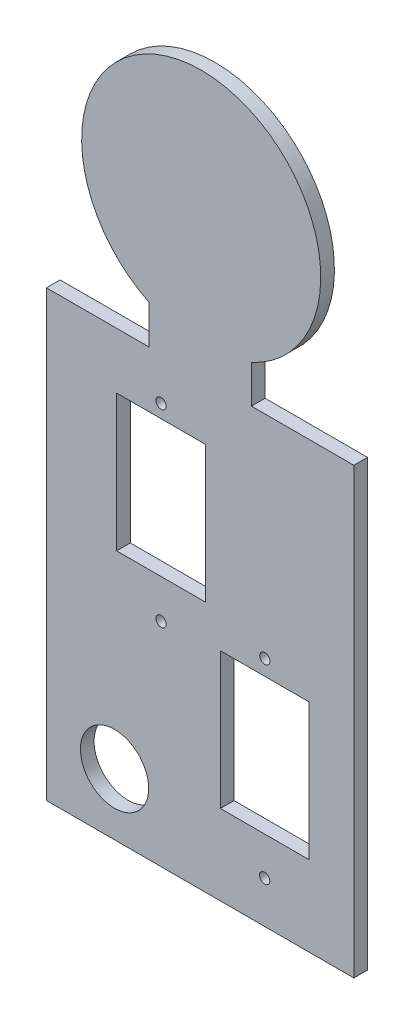
ISO-10303-21;
HEADER;
FILE_DESCRIPTION(('STEP AP214'),'2;1');
FILE_NAME('part.step','',(''),(''),'','','');
FILE_SCHEMA(('AUTOMOTIVE_DESIGN { 1 0 10303 214 1 1 1 1 }'));
ENDSEC;
DATA;
#1=APPLICATION_CONTEXT('core data for automotive mechanical design processes');
#2=APPLICATION_PROTOCOL_DEFINITION('international standard','automotive_design',2000,#1);
#3=PRODUCT_CONTEXT('',#1,'mechanical');
#4=PRODUCT('Part','Part','',(#3));
#5=PRODUCT_RELATED_PRODUCT_CATEGORY('part','',(#4));
#6=PRODUCT_DEFINITION_FORMATION('','',#4);
#7=PRODUCT_DEFINITION_CONTEXT('part definition',#1,'design');
#8=PRODUCT_DEFINITION('design','',#6,#7);
#9=PRODUCT_DEFINITION_SHAPE('','',#8);
#10=(LENGTH_UNIT() NAMED_UNIT(*) SI_UNIT(.MILLI.,.METRE.));
#11=(NAMED_UNIT(*) PLANE_ANGLE_UNIT() SI_UNIT($,.RADIAN.));
#12=(NAMED_UNIT(*) SI_UNIT($,.STERADIAN.) SOLID_ANGLE_UNIT());
#13=UNCERTAINTY_MEASURE_WITH_UNIT(LENGTH_MEASURE(1.E-05),#10,'distance_accuracy_value','');
#14=(GEOMETRIC_REPRESENTATION_CONTEXT(3) GLOBAL_UNCERTAINTY_ASSIGNED_CONTEXT((#13)) GLOBAL_UNIT_ASSIGNED_CONTEXT((#10,
#11,#12)) REPRESENTATION_CONTEXT('',''));
#15=CARTESIAN_POINT('',(0.,0.,0.));
#16=DIRECTION('',(0.,0.,1.));
#17=DIRECTION('',(1.,0.,0.));
#18=AXIS2_PLACEMENT_3D('',#15,#16,#17);
#19=CARTESIAN_POINT('',(0.,0.,2.));
#20=DIRECTION('',(0.,0.,-1.));
#21=DIRECTION('',(-1.,0.,0.));
#22=AXIS2_PLACEMENT_3D('',#19,#20,#21);
#23=CYLINDRICAL_SURFACE('',#22,17.5);
#24=CARTESIAN_POINT('',(0.,0.,0.));
#25=DIRECTION('',(0.,0.,1.));
#26=DIRECTION('',(1.,0.,0.));
#27=AXIS2_PLACEMENT_3D('',#24,#25,#26);
#28=CIRCLE('',#27,17.5);
#29=CARTESIAN_POINT('',(7.34840143217051,-15.8824115420699,0.));
#30=VERTEX_POINT('',#29);
#31=CARTESIAN_POINT('',(-7.65159856782949,-15.7385844140059,0.));
#32=VERTEX_POINT('',#31);
#33=EDGE_CURVE('E192',#30,#32,#28,.T.);
#34=ORIENTED_EDGE('',*,*,#33,.T.);
#35=DIRECTION('',(0.,0.,-1.));
#36=VECTOR('',#35,1.);
#37=CARTESIAN_POINT('',(-7.65159856782949,-15.7385844140059,2.));
#38=LINE('',#37,#36);
#39=CARTESIAN_POINT('',(-7.65159856782949,-15.7385844140059,2.));
#40=VERTEX_POINT('',#39);
#41=EDGE_CURVE('E272',#40,#32,#38,.T.);
#42=ORIENTED_EDGE('',*,*,#41,.F.);
#43=CARTESIAN_POINT('',(0.,0.,2.));
#44=DIRECTION('',(0.,0.,1.));
#45=DIRECTION('',(1.,0.,0.));
#46=AXIS2_PLACEMENT_3D('',#43,#44,#45);
#47=CIRCLE('',#46,17.5);
#48=CARTESIAN_POINT('',(7.34840143217051,-15.8824115420699,2.));
#49=VERTEX_POINT('',#48);
#50=EDGE_CURVE('E214',#49,#40,#47,.T.);
#51=ORIENTED_EDGE('',*,*,#50,.F.);
#52=DIRECTION('',(0.,0.,-1.));
#53=VECTOR('',#52,1.);
#54=CARTESIAN_POINT('',(7.34840143217051,-15.8824115420699,2.));
#55=LINE('',#54,#53);
#56=EDGE_CURVE('E236',#49,#30,#55,.T.);
#57=ORIENTED_EDGE('',*,*,#56,.T.);
#58=EDGE_LOOP('',(#34,#42,#51,#57));
#59=FACE_BOUND('',#58,.T.);
#60=ADVANCED_FACE('F47',(#59),#23,.T.);
#61=CARTESIAN_POINT('',(-7.65159856782949,-15.7385844140059,2.));
#62=DIRECTION('',(1.,0.,0.));
#63=DIRECTION('',(0.,0.,-1.));
#64=AXIS2_PLACEMENT_3D('',#61,#62,#63);
#65=PLANE('',#64);
#66=DIRECTION('',(0.,-1.,0.));
#67=VECTOR('',#66,1.);
#68=CARTESIAN_POINT('',(-7.65159856782949,-15.7385844140059,0.));
#69=LINE('',#68,#67);
#70=CARTESIAN_POINT('',(-7.65159856782949,-21.4190799899302,0.));
#71=VERTEX_POINT('',#70);
#72=EDGE_CURVE('E239',#32,#71,#69,.T.);
#73=ORIENTED_EDGE('',*,*,#72,.T.);
#74=DIRECTION('',(0.,0.,-1.));
#75=VECTOR('',#74,1.);
#76=CARTESIAN_POINT('',(-7.65159856782949,-21.4190799899302,2.));
#77=LINE('',#76,#75);
#78=CARTESIAN_POINT('',(-7.65159856782949,-21.4190799899302,2.));
#79=VERTEX_POINT('',#78);
#80=EDGE_CURVE('E270',#79,#71,#77,.T.);
#81=ORIENTED_EDGE('',*,*,#80,.F.);
#82=DIRECTION('',(0.,-1.,0.));
#83=VECTOR('',#82,1.);
#84=CARTESIAN_POINT('',(-7.65159856782949,-15.7385844140059,2.));
#85=LINE('',#84,#83);
#86=EDGE_CURVE('E217',#40,#79,#85,.T.);
#87=ORIENTED_EDGE('',*,*,#86,.F.);
#88=ORIENTED_EDGE('',*,*,#41,.T.);
#89=EDGE_LOOP('',(#73,#81,#87,#88));
#90=FACE_BOUND('',#89,.T.);
#91=ADVANCED_FACE('F325',(#90),#65,.F.);
#92=CARTESIAN_POINT('',(-22.6515985678295,-21.4190799899302,2.));
#93=DIRECTION('',(0.,1.,0.));
#94=DIRECTION('',(0.,0.,1.));
#95=AXIS2_PLACEMENT_3D('',#92,#93,#94);
#96=PLANE('',#95);
#97=DIRECTION('',(1.,0.,0.));
#98=VECTOR('',#97,1.);
#99=CARTESIAN_POINT('',(-22.6515985678295,-21.4190799899302,0.));
#100=LINE('',#99,#98);
#101=CARTESIAN_POINT('',(-22.6515985678295,-21.4190799899302,0.));
#102=VERTEX_POINT('',#101);
#103=EDGE_CURVE('E242',#102,#71,#100,.T.);
#104=ORIENTED_EDGE('',*,*,#103,.F.);
#105=DIRECTION('',(0.,0.,-1.));
#106=VECTOR('',#105,1.);
#107=CARTESIAN_POINT('',(-22.6515985678295,-21.4190799899302,2.));
#108=LINE('',#107,#106);
#109=CARTESIAN_POINT('',(-22.6515985678295,-21.4190799899302,2.));
#110=VERTEX_POINT('',#109);
#111=EDGE_CURVE('E268',#110,#102,#108,.T.);
#112=ORIENTED_EDGE('',*,*,#111,.F.);
#113=DIRECTION('',(1.,0.,0.));
#114=VECTOR('',#113,1.);
#115=CARTESIAN_POINT('',(-22.6515985678295,-21.4190799899302,2.));
#116=LINE('',#115,#114);
#117=EDGE_CURVE('E220',#110,#79,#116,.T.);
#118=ORIENTED_EDGE('',*,*,#117,.T.);
#119=ORIENTED_EDGE('',*,*,#80,.T.);
#120=EDGE_LOOP('',(#104,#112,#118,#119));
#121=FACE_BOUND('',#120,.T.);
#122=ADVANCED_FACE('F330',(#121),#96,.T.);
#123=CARTESIAN_POINT('',(-22.6515985678295,-21.4190799899302,2.));
#124=DIRECTION('',(1.,0.,0.));
#125=DIRECTION('',(0.,1.,0.));
#126=AXIS2_PLACEMENT_3D('',#123,#124,#125);
#127=PLANE('',#126);
#128=DIRECTION('',(0.,-1.,0.));
#129=VECTOR('',#128,1.);
#130=CARTESIAN_POINT('',(-22.6515985678295,-21.4190799899302,0.));
#131=LINE('',#130,#129);
#132=CARTESIAN_POINT('',(-22.6515985678295,-86.4190799899302,0.));
#133=VERTEX_POINT('',#132);
#134=EDGE_CURVE('E245',#102,#133,#131,.T.);
#135=ORIENTED_EDGE('',*,*,#134,.T.);
#136=DIRECTION('',(0.,0.,-1.));
#137=VECTOR('',#136,1.);
#138=CARTESIAN_POINT('',(-22.6515985678295,-86.4190799899302,2.));
#139=LINE('',#138,#137);
#140=CARTESIAN_POINT('',(-22.6515985678295,-86.4190799899302,2.));
#141=VERTEX_POINT('',#140);
#142=EDGE_CURVE('E265',#141,#133,#139,.T.);
#143=ORIENTED_EDGE('',*,*,#142,.F.);
#144=DIRECTION('',(0.,-1.,0.));
#145=VECTOR('',#144,1.);
#146=CARTESIAN_POINT('',(-22.6515985678295,-21.4190799899302,2.));
#147=LINE('',#146,#145);
#148=EDGE_CURVE('E223',#110,#141,#147,.T.);
#149=ORIENTED_EDGE('',*,*,#148,.F.);
#150=ORIENTED_EDGE('',*,*,#111,.T.);
#151=EDGE_LOOP('',(#135,#143,#149,#150));
#152=FACE_BOUND('',#151,.T.);
#153=ADVANCED_FACE('F357',(#152),#127,.F.);
#154=CARTESIAN_POINT('',(-22.6515985678295,-86.4190799899302,2.));
#155=DIRECTION('',(0.,1.,0.));
#156=DIRECTION('',(0.,0.,1.));
#157=AXIS2_PLACEMENT_3D('',#154,#155,#156);
#158=PLANE('',#157);
#159=DIRECTION('',(1.,0.,0.));
#160=VECTOR('',#159,1.);
#161=CARTESIAN_POINT('',(-22.6515985678295,-86.4190799899302,0.));
#162=LINE('',#161,#160);
#163=CARTESIAN_POINT('',(22.3484014321705,-86.4190799899302,0.));
#164=VERTEX_POINT('',#163);
#165=EDGE_CURVE('E247',#133,#164,#162,.T.);
#166=ORIENTED_EDGE('',*,*,#165,.T.);
#167=DIRECTION('',(0.,0.,-1.));
#168=VECTOR('',#167,1.);
#169=CARTESIAN_POINT('',(22.3484014321705,-86.4190799899302,2.));
#170=LINE('',#169,#168);
#171=CARTESIAN_POINT('',(22.3484014321705,-86.4190799899302,2.));
#172=VERTEX_POINT('',#171);
#173=EDGE_CURVE('E263',#172,#164,#170,.T.);
#174=ORIENTED_EDGE('',*,*,#173,.F.);
#175=DIRECTION('',(1.,0.,0.));
#176=VECTOR('',#175,1.);
#177=CARTESIAN_POINT('',(-22.6515985678295,-86.4190799899302,2.));
#178=LINE('',#177,#176);
#179=EDGE_CURVE('E225',#141,#172,#178,.T.);
#180=ORIENTED_EDGE('',*,*,#179,.F.);
#181=ORIENTED_EDGE('',*,*,#142,.T.);
#182=EDGE_LOOP('',(#166,#174,#180,#181));
#183=FACE_BOUND('',#182,.T.);
#184=ADVANCED_FACE('F353',(#183),#158,.F.);
#185=CARTESIAN_POINT('',(22.3484014321705,-21.4190799899302,2.));
#186=DIRECTION('',(1.,0.,0.));
#187=DIRECTION('',(0.,1.,0.));
#188=AXIS2_PLACEMENT_3D('',#185,#186,#187);
#189=PLANE('',#188);
#190=DIRECTION('',(0.,-1.,0.));
#191=VECTOR('',#190,1.);
#192=CARTESIAN_POINT('',(22.3484014321705,-21.4190799899302,0.));
#193=LINE('',#192,#191);
#194=CARTESIAN_POINT('',(22.3484014321705,-21.4190799899302,0.));
#195=VERTEX_POINT('',#194);
#196=EDGE_CURVE('E250',#195,#164,#193,.T.);
#197=ORIENTED_EDGE('',*,*,#196,.F.);
#198=DIRECTION('',(0.,0.,-1.));
#199=VECTOR('',#198,1.);
#200=CARTESIAN_POINT('',(22.3484014321705,-21.4190799899302,2.));
#201=LINE('',#200,#199);
#202=CARTESIAN_POINT('',(22.3484014321705,-21.4190799899302,2.));
#203=VERTEX_POINT('',#202);
#204=EDGE_CURVE('E261',#203,#195,#201,.T.);
#205=ORIENTED_EDGE('',*,*,#204,.F.);
#206=DIRECTION('',(0.,-1.,0.));
#207=VECTOR('',#206,1.);
#208=CARTESIAN_POINT('',(22.3484014321705,-21.4190799899302,2.));
#209=LINE('',#208,#207);
#210=EDGE_CURVE('E227',#203,#172,#209,.T.);
#211=ORIENTED_EDGE('',*,*,#210,.T.);
#212=ORIENTED_EDGE('',*,*,#173,.T.);
#213=EDGE_LOOP('',(#197,#205,#211,#212));
#214=FACE_BOUND('',#213,.T.);
#215=ADVANCED_FACE('F348',(#214),#189,.T.);
#216=CARTESIAN_POINT('',(7.34840143217051,-21.4190799899302,2.));
#217=DIRECTION('',(0.,1.,0.));
#218=DIRECTION('',(0.,0.,1.));
#219=AXIS2_PLACEMENT_3D('',#216,#217,#218);
#220=PLANE('',#219);
#221=DIRECTION('',(1.,0.,0.));
#222=VECTOR('',#221,1.);
#223=CARTESIAN_POINT('',(7.34840143217051,-21.4190799899302,0.));
#224=LINE('',#223,#222);
#225=CARTESIAN_POINT('',(7.34840143217051,-21.4190799899302,0.));
#226=VERTEX_POINT('',#225);
#227=EDGE_CURVE('E253',#226,#195,#224,.T.);
#228=ORIENTED_EDGE('',*,*,#227,.F.);
#229=DIRECTION('',(0.,0.,-1.));
#230=VECTOR('',#229,1.);
#231=CARTESIAN_POINT('',(7.34840143217051,-21.4190799899302,2.));
#232=LINE('',#231,#230);
#233=CARTESIAN_POINT('',(7.34840143217051,-21.4190799899302,2.));
#234=VERTEX_POINT('',#233);
#235=EDGE_CURVE('E259',#234,#226,#232,.T.);
#236=ORIENTED_EDGE('',*,*,#235,.F.);
#237=DIRECTION('',(1.,0.,0.));
#238=VECTOR('',#237,1.);
#239=CARTESIAN_POINT('',(7.34840143217051,-21.4190799899302,2.));
#240=LINE('',#239,#238);
#241=EDGE_CURVE('E230',#234,#203,#240,.T.);
#242=ORIENTED_EDGE('',*,*,#241,.T.);
#243=ORIENTED_EDGE('',*,*,#204,.T.);
#244=EDGE_LOOP('',(#228,#236,#242,#243));
#245=FACE_BOUND('',#244,.T.);
#246=ADVANCED_FACE('F343',(#245),#220,.T.);
#247=CARTESIAN_POINT('',(7.34840143217051,-15.8824115420699,2.));
#248=DIRECTION('',(1.,0.,0.));
#249=DIRECTION('',(0.,0.,-1.));
#250=AXIS2_PLACEMENT_3D('',#247,#248,#249);
#251=PLANE('',#250);
#252=DIRECTION('',(0.,-1.,0.));
#253=VECTOR('',#252,1.);
#254=CARTESIAN_POINT('',(7.34840143217051,-15.8824115420699,0.));
#255=LINE('',#254,#253);
#256=EDGE_CURVE('E218',#30,#226,#255,.T.);
#257=ORIENTED_EDGE('',*,*,#256,.F.);
#258=ORIENTED_EDGE('',*,*,#56,.F.);
#259=DIRECTION('',(0.,-1.,0.));
#260=VECTOR('',#259,1.);
#261=CARTESIAN_POINT('',(7.34840143217051,-15.8824115420699,2.));
#262=LINE('',#261,#260);
#263=EDGE_CURVE('E233',#49,#234,#262,.T.);
#264=ORIENTED_EDGE('',*,*,#263,.T.);
#265=ORIENTED_EDGE('',*,*,#235,.T.);
#266=EDGE_LOOP('',(#257,#258,#264,#265));
#267=FACE_BOUND('',#266,.T.);
#268=ADVANCED_FACE('F338',(#267),#251,.T.);
#269=CARTESIAN_POINT('',(0.,0.,2.));
#270=DIRECTION('',(0.,0.,1.));
#271=DIRECTION('',(1.,0.,0.));
#272=AXIS2_PLACEMENT_3D('',#269,#270,#271);
#273=PLANE('',#272);
#274=CARTESIAN_POINT('',(-12.6867038328696,-77.4152055983344,2.));
#275=DIRECTION('',(0.,0.,1.));
#276=DIRECTION('',(1.,0.,0.));
#277=AXIS2_PLACEMENT_3D('',#274,#275,#276);
#278=CIRCLE('',#277,5.00000000000001);
#279=CARTESIAN_POINT('',(-7.68670383286962,-77.4152055983344,2.));
#280=VERTEX_POINT('',#279);
#281=EDGE_CURVE('E608',#280,#280,#278,.T.);
#282=ORIENTED_EDGE('',*,*,#281,.F.);
#283=EDGE_LOOP('',(#282));
#284=FACE_BOUND('',#283,.T.);
#285=CARTESIAN_POINT('',(-5.87460933445811,-27.6794868217812,2.));
#286=DIRECTION('',(0.,0.,1.));
#287=DIRECTION('',(1.,0.,0.));
#288=AXIS2_PLACEMENT_3D('',#285,#286,#287);
#289=CIRCLE('',#288,0.749999999999999);
#290=CARTESIAN_POINT('',(-5.12460933445811,-27.6794868217812,2.));
#291=VERTEX_POINT('',#290);
#292=EDGE_CURVE('E296',#291,#291,#289,.T.);
#293=ORIENTED_EDGE('',*,*,#292,.F.);
#294=EDGE_LOOP('',(#293));
#295=FACE_BOUND('',#294,.T.);
#296=CARTESIAN_POINT('',(-5.87460933445811,-55.3133694888777,2.));
#297=DIRECTION('',(0.,0.,1.));
#298=DIRECTION('',(1.,0.,0.));
#299=AXIS2_PLACEMENT_3D('',#296,#297,#298);
#300=CIRCLE('',#299,0.749999999999999);
#301=CARTESIAN_POINT('',(-5.12460933445811,-55.3133694888777,2.));
#302=VERTEX_POINT('',#301);
#303=EDGE_CURVE('E604',#302,#302,#300,.T.);
#304=ORIENTED_EDGE('',*,*,#303,.F.);
#305=EDGE_LOOP('',(#304));
#306=FACE_BOUND('',#305,.T.);
#307=CARTESIAN_POINT('',(9.31821406157874,-52.4318876720628,2.));
#308=DIRECTION('',(0.,0.,1.));
#309=DIRECTION('',(1.,0.,0.));
#310=AXIS2_PLACEMENT_3D('',#307,#308,#309);
#311=CIRCLE('',#310,0.75);
#312=CARTESIAN_POINT('',(10.0682140615787,-52.4318876720628,2.));
#313=VERTEX_POINT('',#312);
#314=EDGE_CURVE('E601',#313,#313,#311,.T.);
#315=ORIENTED_EDGE('',*,*,#314,.F.);
#316=EDGE_LOOP('',(#315));
#317=FACE_BOUND('',#316,.T.);
#318=CARTESIAN_POINT('',(9.29050009181288,-80.2906610274415,2.));
#319=DIRECTION('',(0.,0.,1.));
#320=DIRECTION('',(1.,0.,0.));
#321=AXIS2_PLACEMENT_3D('',#318,#319,#320);
#322=CIRCLE('',#321,0.75);
#323=CARTESIAN_POINT('',(10.0405000918129,-80.2906610274415,2.));
#324=VERTEX_POINT('',#323);
#325=EDGE_CURVE('E598',#324,#324,#322,.T.);
#326=ORIENTED_EDGE('',*,*,#325,.F.);
#327=EDGE_LOOP('',(#326));
#328=FACE_BOUND('',#327,.T.);
#329=DIRECTION('',(0.,-1.,0.));
#330=VECTOR('',#329,1.);
#331=CARTESIAN_POINT('',(-12.3746093344581,-29.6313474679882,2.));
#332=LINE('',#331,#330);
#333=CARTESIAN_POINT('',(-12.3746093344581,-29.6313474679882,2.));
#334=VERTEX_POINT('',#333);
#335=CARTESIAN_POINT('',(-12.3746093344581,-49.6313474679882,2.));
#336=VERTEX_POINT('',#335);
#337=EDGE_CURVE('E63',#334,#336,#332,.T.);
#338=ORIENTED_EDGE('',*,*,#337,.F.);
#339=DIRECTION('',(-1.,0.,0.));
#340=VECTOR('',#339,1.);
#341=CARTESIAN_POINT('',(-12.3746093344581,-29.6313474679882,2.));
#342=LINE('',#341,#340);
#343=CARTESIAN_POINT('',(0.625390665541887,-29.6313474679882,2.));
#344=VERTEX_POINT('',#343);
#345=EDGE_CURVE('E185',#344,#334,#342,.T.);
#346=ORIENTED_EDGE('',*,*,#345,.F.);
#347=DIRECTION('',(0.,1.,0.));
#348=VECTOR('',#347,1.);
#349=CARTESIAN_POINT('',(0.625390665541887,-29.6313474679882,2.));
#350=LINE('',#349,#348);
#351=CARTESIAN_POINT('',(0.625390665541892,-49.6313474679882,2.));
#352=VERTEX_POINT('',#351);
#353=EDGE_CURVE('E168',#352,#344,#350,.T.);
#354=ORIENTED_EDGE('',*,*,#353,.F.);
#355=DIRECTION('',(1.,0.,0.));
#356=VECTOR('',#355,1.);
#357=CARTESIAN_POINT('',(-12.3746093344581,-49.6313474679882,2.));
#358=LINE('',#357,#356);
#359=EDGE_CURVE('E178',#336,#352,#358,.T.);
#360=ORIENTED_EDGE('',*,*,#359,.F.);
#361=EDGE_LOOP('',(#338,#346,#354,#360));
#362=FACE_BOUND('',#361,.T.);
#363=DIRECTION('',(0.,-1.,0.));
#364=VECTOR('',#363,1.);
#365=CARTESIAN_POINT('',(2.80668357301406,-54.6997474055775,2.));
#366=LINE('',#365,#364);
#367=CARTESIAN_POINT('',(2.80668357301406,-54.6997474055775,2.));
#368=VERTEX_POINT('',#367);
#369=CARTESIAN_POINT('',(2.80668357301407,-74.6997474055775,2.));
#370=VERTEX_POINT('',#369);
#371=EDGE_CURVE('E71',#368,#370,#366,.T.);
#372=ORIENTED_EDGE('',*,*,#371,.F.);
#373=DIRECTION('',(-1.,0.,0.));
#374=VECTOR('',#373,1.);
#375=CARTESIAN_POINT('',(2.80668357301406,-54.6997474055775,2.));
#376=LINE('',#375,#374);
#377=CARTESIAN_POINT('',(15.8066835730141,-54.6997474055775,2.));
#378=VERTEX_POINT('',#377);
#379=EDGE_CURVE('E197',#378,#368,#376,.T.);
#380=ORIENTED_EDGE('',*,*,#379,.F.);
#381=DIRECTION('',(0.,1.,0.));
#382=VECTOR('',#381,1.);
#383=CARTESIAN_POINT('',(15.8066835730141,-54.6997474055775,2.));
#384=LINE('',#383,#382);
#385=CARTESIAN_POINT('',(15.8066835730141,-74.6997474055775,2.));
#386=VERTEX_POINT('',#385);
#387=EDGE_CURVE('E207',#386,#378,#384,.T.);
#388=ORIENTED_EDGE('',*,*,#387,.F.);
#389=DIRECTION('',(1.,0.,0.));
#390=VECTOR('',#389,1.);
#391=CARTESIAN_POINT('',(2.80668357301407,-74.6997474055775,2.));
#392=LINE('',#391,#390);
#393=EDGE_CURVE('E210',#370,#386,#392,.T.);
#394=ORIENTED_EDGE('',*,*,#393,.F.);
#395=EDGE_LOOP('',(#372,#380,#388,#394));
#396=FACE_BOUND('',#395,.T.);
#397=ORIENTED_EDGE('',*,*,#50,.T.);
#398=ORIENTED_EDGE('',*,*,#86,.T.);
#399=ORIENTED_EDGE('',*,*,#117,.F.);
#400=ORIENTED_EDGE('',*,*,#148,.T.);
#401=ORIENTED_EDGE('',*,*,#179,.T.);
#402=ORIENTED_EDGE('',*,*,#210,.F.);
#403=ORIENTED_EDGE('',*,*,#241,.F.);
#404=ORIENTED_EDGE('',*,*,#263,.F.);
#405=EDGE_LOOP('',(#397,#398,#399,#400,#401,#402,#403,#404));
#406=FACE_BOUND('',#405,.T.);
#407=ADVANCED_FACE('F182',(#284,#295,#306,#317,#328,#362,#396,#406),#273,.T.);
#408=CARTESIAN_POINT('',(0.,0.,0.));
#409=DIRECTION('',(0.,0.,1.));
#410=DIRECTION('',(1.,0.,0.));
#411=AXIS2_PLACEMENT_3D('',#408,#409,#410);
#412=PLANE('',#411);
#413=CARTESIAN_POINT('',(-12.6867038328696,-77.4152055983344,0.));
#414=DIRECTION('',(0.,0.,1.));
#415=DIRECTION('',(1.,0.,0.));
#416=AXIS2_PLACEMENT_3D('',#413,#414,#415);
#417=CIRCLE('',#416,5.00000000000001);
#418=CARTESIAN_POINT('',(-7.68670383286962,-77.4152055983344,0.));
#419=VERTEX_POINT('',#418);
#420=EDGE_CURVE('E50',#419,#419,#417,.T.);
#421=ORIENTED_EDGE('',*,*,#420,.T.);
#422=EDGE_LOOP('',(#421));
#423=FACE_BOUND('',#422,.T.);
#424=CARTESIAN_POINT('',(-5.87460933445811,-27.6794868217812,0.));
#425=DIRECTION('',(0.,0.,1.));
#426=DIRECTION('',(1.,0.,0.));
#427=AXIS2_PLACEMENT_3D('',#424,#425,#426);
#428=CIRCLE('',#427,0.749999999999999);
#429=CARTESIAN_POINT('',(-5.12460933445811,-27.6794868217812,0.));
#430=VERTEX_POINT('',#429);
#431=EDGE_CURVE('E204',#430,#430,#428,.T.);
#432=ORIENTED_EDGE('',*,*,#431,.T.);
#433=EDGE_LOOP('',(#432));
#434=FACE_BOUND('',#433,.T.);
#435=CARTESIAN_POINT('',(-5.87460933445811,-55.3133694888777,0.));
#436=DIRECTION('',(0.,0.,1.));
#437=DIRECTION('',(1.,0.,0.));
#438=AXIS2_PLACEMENT_3D('',#435,#436,#437);
#439=CIRCLE('',#438,0.749999999999999);
#440=CARTESIAN_POINT('',(-5.12460933445811,-55.3133694888777,0.));
#441=VERTEX_POINT('',#440);
#442=EDGE_CURVE('E299',#441,#441,#439,.T.);
#443=ORIENTED_EDGE('',*,*,#442,.T.);
#444=EDGE_LOOP('',(#443));
#445=FACE_BOUND('',#444,.T.);
#446=CARTESIAN_POINT('',(9.31821406157874,-52.4318876720628,0.));
#447=DIRECTION('',(0.,0.,1.));
#448=DIRECTION('',(1.,0.,0.));
#449=AXIS2_PLACEMENT_3D('',#446,#447,#448);
#450=CIRCLE('',#449,0.75);
#451=CARTESIAN_POINT('',(10.0682140615787,-52.4318876720628,0.));
#452=VERTEX_POINT('',#451);
#453=EDGE_CURVE('E295',#452,#452,#450,.T.);
#454=ORIENTED_EDGE('',*,*,#453,.T.);
#455=EDGE_LOOP('',(#454));
#456=FACE_BOUND('',#455,.T.);
#457=CARTESIAN_POINT('',(9.29050009181288,-80.2906610274415,0.));
#458=DIRECTION('',(0.,0.,1.));
#459=DIRECTION('',(1.,0.,0.));
#460=AXIS2_PLACEMENT_3D('',#457,#458,#459);
#461=CIRCLE('',#460,0.75);
#462=CARTESIAN_POINT('',(10.0405000918129,-80.2906610274415,0.));
#463=VERTEX_POINT('',#462);
#464=EDGE_CURVE('E292',#463,#463,#461,.T.);
#465=ORIENTED_EDGE('',*,*,#464,.T.);
#466=EDGE_LOOP('',(#465));
#467=FACE_BOUND('',#466,.T.);
#468=DIRECTION('',(-1.,0.,0.));
#469=VECTOR('',#468,1.);
#470=CARTESIAN_POINT('',(0.,-29.6313474679882,0.));
#471=LINE('',#470,#469);
#472=CARTESIAN_POINT('',(0.625390665541887,-29.6313474679882,0.));
#473=VERTEX_POINT('',#472);
#474=CARTESIAN_POINT('',(-12.3746093344581,-29.6313474679882,0.));
#475=VERTEX_POINT('',#474);
#476=EDGE_CURVE('E55',#473,#475,#471,.T.);
#477=ORIENTED_EDGE('',*,*,#476,.T.);
#478=DIRECTION('',(0.,-1.,0.));
#479=VECTOR('',#478,1.);
#480=CARTESIAN_POINT('',(-12.3746093344581,0.,0.));
#481=LINE('',#480,#479);
#482=CARTESIAN_POINT('',(-12.3746093344581,-49.6313474679882,0.));
#483=VERTEX_POINT('',#482);
#484=EDGE_CURVE('E11',#475,#483,#481,.T.);
#485=ORIENTED_EDGE('',*,*,#484,.T.);
#486=DIRECTION('',(1.,0.,0.));
#487=VECTOR('',#486,1.);
#488=CARTESIAN_POINT('',(0.,-49.6313474679882,0.));
#489=LINE('',#488,#487);
#490=CARTESIAN_POINT('',(0.625390665541892,-49.6313474679882,0.));
#491=VERTEX_POINT('',#490);
#492=EDGE_CURVE('E287',#483,#491,#489,.T.);
#493=ORIENTED_EDGE('',*,*,#492,.T.);
#494=DIRECTION('',(0.,1.,0.));
#495=VECTOR('',#494,1.);
#496=CARTESIAN_POINT('',(0.625390665541879,0.,0.));
#497=LINE('',#496,#495);
#498=EDGE_CURVE('E171',#491,#473,#497,.T.);
#499=ORIENTED_EDGE('',*,*,#498,.T.);
#500=EDGE_LOOP('',(#477,#485,#493,#499));
#501=FACE_BOUND('',#500,.T.);
#502=DIRECTION('',(-1.,0.,0.));
#503=VECTOR('',#502,1.);
#504=CARTESIAN_POINT('',(0.,-54.6997474055775,0.));
#505=LINE('',#504,#503);
#506=CARTESIAN_POINT('',(15.8066835730141,-54.6997474055775,0.));
#507=VERTEX_POINT('',#506);
#508=CARTESIAN_POINT('',(2.80668357301406,-54.6997474055775,0.));
#509=VERTEX_POINT('',#508);
#510=EDGE_CURVE('E281',#507,#509,#505,.T.);
#511=ORIENTED_EDGE('',*,*,#510,.T.);
#512=DIRECTION('',(0.,-1.,0.));
#513=VECTOR('',#512,1.);
#514=CARTESIAN_POINT('',(2.80668357301406,0.,0.));
#515=LINE('',#514,#513);
#516=CARTESIAN_POINT('',(2.80668357301407,-74.6997474055775,0.));
#517=VERTEX_POINT('',#516);
#518=EDGE_CURVE('E284',#509,#517,#515,.T.);
#519=ORIENTED_EDGE('',*,*,#518,.T.);
#520=DIRECTION('',(1.,0.,0.));
#521=VECTOR('',#520,1.);
#522=CARTESIAN_POINT('',(0.,-74.6997474055775,0.));
#523=LINE('',#522,#521);
#524=CARTESIAN_POINT('',(15.8066835730141,-74.6997474055775,0.));
#525=VERTEX_POINT('',#524);
#526=EDGE_CURVE('E275',#517,#525,#523,.T.);
#527=ORIENTED_EDGE('',*,*,#526,.T.);
#528=DIRECTION('',(0.,1.,0.));
#529=VECTOR('',#528,1.);
#530=CARTESIAN_POINT('',(15.8066835730141,0.,0.));
#531=LINE('',#530,#529);
#532=EDGE_CURVE('E278',#525,#507,#531,.T.);
#533=ORIENTED_EDGE('',*,*,#532,.T.);
#534=EDGE_LOOP('',(#511,#519,#527,#533));
#535=FACE_BOUND('',#534,.T.);
#536=ORIENTED_EDGE('',*,*,#33,.F.);
#537=ORIENTED_EDGE('',*,*,#256,.T.);
#538=ORIENTED_EDGE('',*,*,#227,.T.);
#539=ORIENTED_EDGE('',*,*,#196,.T.);
#540=ORIENTED_EDGE('',*,*,#165,.F.);
#541=ORIENTED_EDGE('',*,*,#134,.F.);
#542=ORIENTED_EDGE('',*,*,#103,.T.);
#543=ORIENTED_EDGE('',*,*,#72,.F.);
#544=EDGE_LOOP('',(#536,#537,#538,#539,#540,#541,#542,#543));
#545=FACE_BOUND('',#544,.T.);
#546=ADVANCED_FACE('F304',(#423,#434,#445,#456,#467,#501,#535,#545),#412,.F.);
#547=CARTESIAN_POINT('',(2.80668357301406,-54.6997474055775,-9.5));
#548=DIRECTION('',(-1.,0.,0.));
#549=DIRECTION('',(0.,-1.,0.));
#550=AXIS2_PLACEMENT_3D('',#547,#548,#549);
#551=PLANE('',#550);
#552=DIRECTION('',(0.,0.,1.));
#553=VECTOR('',#552,1.);
#554=CARTESIAN_POINT('',(2.80668357301406,-54.6997474055775,-9.5));
#555=LINE('',#554,#553);
#556=EDGE_CURVE('E202',#509,#368,#555,.T.);
#557=ORIENTED_EDGE('',*,*,#556,.T.);
#558=ORIENTED_EDGE('',*,*,#371,.T.);
#559=DIRECTION('',(0.,0.,1.));
#560=VECTOR('',#559,1.);
#561=CARTESIAN_POINT('',(2.80668357301407,-74.6997474055775,-9.5));
#562=LINE('',#561,#560);
#563=EDGE_CURVE('E195',#517,#370,#562,.T.);
#564=ORIENTED_EDGE('',*,*,#563,.F.);
#565=ORIENTED_EDGE('',*,*,#518,.F.);
#566=EDGE_LOOP('',(#557,#558,#564,#565));
#567=FACE_BOUND('',#566,.T.);
#568=ADVANCED_FACE('F370',(#567),#551,.F.);
#569=CARTESIAN_POINT('',(2.80668357301406,-54.6997474055775,-9.5));
#570=DIRECTION('',(0.,1.,0.));
#571=DIRECTION('',(0.,0.,1.));
#572=AXIS2_PLACEMENT_3D('',#569,#570,#571);
#573=PLANE('',#572);
#574=DIRECTION('',(0.,0.,1.));
#575=VECTOR('',#574,1.);
#576=CARTESIAN_POINT('',(15.8066835730141,-54.6997474055775,-9.5));
#577=LINE('',#576,#575);
#578=EDGE_CURVE('E200',#507,#378,#577,.T.);
#579=ORIENTED_EDGE('',*,*,#578,.T.);
#580=ORIENTED_EDGE('',*,*,#379,.T.);
#581=ORIENTED_EDGE('',*,*,#556,.F.);
#582=ORIENTED_EDGE('',*,*,#510,.F.);
#583=EDGE_LOOP('',(#579,#580,#581,#582));
#584=FACE_BOUND('',#583,.T.);
#585=ADVANCED_FACE('F377',(#584),#573,.F.);
#586=CARTESIAN_POINT('',(15.8066835730141,-54.6997474055775,-9.5));
#587=DIRECTION('',(1.,0.,0.));
#588=DIRECTION('',(0.,1.,0.));
#589=AXIS2_PLACEMENT_3D('',#586,#587,#588);
#590=PLANE('',#589);
#591=DIRECTION('',(0.,0.,1.));
#592=VECTOR('',#591,1.);
#593=CARTESIAN_POINT('',(15.8066835730141,-74.6997474055775,-9.5));
#594=LINE('',#593,#592);
#595=EDGE_CURVE('E198',#525,#386,#594,.T.);
#596=ORIENTED_EDGE('',*,*,#595,.T.);
#597=ORIENTED_EDGE('',*,*,#387,.T.);
#598=ORIENTED_EDGE('',*,*,#578,.F.);
#599=ORIENTED_EDGE('',*,*,#532,.F.);
#600=EDGE_LOOP('',(#596,#597,#598,#599));
#601=FACE_BOUND('',#600,.T.);
#602=ADVANCED_FACE('F508',(#601),#590,.F.);
#603=CARTESIAN_POINT('',(2.80668357301407,-74.6997474055775,-9.5));
#604=DIRECTION('',(0.,-1.,0.));
#605=DIRECTION('',(0.,0.,-1.));
#606=AXIS2_PLACEMENT_3D('',#603,#604,#605);
#607=PLANE('',#606);
#608=ORIENTED_EDGE('',*,*,#563,.T.);
#609=ORIENTED_EDGE('',*,*,#393,.T.);
#610=ORIENTED_EDGE('',*,*,#595,.F.);
#611=ORIENTED_EDGE('',*,*,#526,.F.);
#612=EDGE_LOOP('',(#608,#609,#610,#611));
#613=FACE_BOUND('',#612,.T.);
#614=ADVANCED_FACE('F499',(#613),#607,.F.);
#615=CARTESIAN_POINT('',(-12.3746093344581,-29.6313474679882,-9.5));
#616=DIRECTION('',(-1.,0.,0.));
#617=DIRECTION('',(0.,-1.,0.));
#618=AXIS2_PLACEMENT_3D('',#615,#616,#617);
#619=PLANE('',#618);
#620=DIRECTION('',(0.,0.,1.));
#621=VECTOR('',#620,1.);
#622=CARTESIAN_POINT('',(-12.3746093344581,-29.6313474679882,-9.5));
#623=LINE('',#622,#621);
#624=EDGE_CURVE('E190',#475,#334,#623,.T.);
#625=ORIENTED_EDGE('',*,*,#624,.T.);
#626=ORIENTED_EDGE('',*,*,#337,.T.);
#627=DIRECTION('',(0.,0.,1.));
#628=VECTOR('',#627,1.);
#629=CARTESIAN_POINT('',(-12.3746093344581,-49.6313474679882,-9.5));
#630=LINE('',#629,#628);
#631=EDGE_CURVE('E175',#483,#336,#630,.T.);
#632=ORIENTED_EDGE('',*,*,#631,.F.);
#633=ORIENTED_EDGE('',*,*,#484,.F.);
#634=EDGE_LOOP('',(#625,#626,#632,#633));
#635=FACE_BOUND('',#634,.T.);
#636=ADVANCED_FACE('F489',(#635),#619,.F.);
#637=CARTESIAN_POINT('',(-12.3746093344581,-29.6313474679882,-9.5));
#638=DIRECTION('',(0.,1.,0.));
#639=DIRECTION('',(0.,0.,1.));
#640=AXIS2_PLACEMENT_3D('',#637,#638,#639);
#641=PLANE('',#640);
#642=DIRECTION('',(0.,0.,1.));
#643=VECTOR('',#642,1.);
#644=CARTESIAN_POINT('',(0.625390665541887,-29.6313474679882,-9.5));
#645=LINE('',#644,#643);
#646=EDGE_CURVE('E174',#473,#344,#645,.T.);
#647=ORIENTED_EDGE('',*,*,#646,.T.);
#648=ORIENTED_EDGE('',*,*,#345,.T.);
#649=ORIENTED_EDGE('',*,*,#624,.F.);
#650=ORIENTED_EDGE('',*,*,#476,.F.);
#651=EDGE_LOOP('',(#647,#648,#649,#650));
#652=FACE_BOUND('',#651,.T.);
#653=ADVANCED_FACE('F480',(#652),#641,.F.);
#654=CARTESIAN_POINT('',(0.625390665541887,-29.6313474679882,-9.5));
#655=DIRECTION('',(1.,0.,0.));
#656=DIRECTION('',(0.,1.,0.));
#657=AXIS2_PLACEMENT_3D('',#654,#655,#656);
#658=PLANE('',#657);
#659=DIRECTION('',(0.,0.,1.));
#660=VECTOR('',#659,1.);
#661=CARTESIAN_POINT('',(0.625390665541892,-49.6313474679882,-9.5));
#662=LINE('',#661,#660);
#663=EDGE_CURVE('E163',#491,#352,#662,.T.);
#664=ORIENTED_EDGE('',*,*,#663,.T.);
#665=ORIENTED_EDGE('',*,*,#353,.T.);
#666=ORIENTED_EDGE('',*,*,#646,.F.);
#667=ORIENTED_EDGE('',*,*,#498,.F.);
#668=EDGE_LOOP('',(#664,#665,#666,#667));
#669=FACE_BOUND('',#668,.T.);
#670=ADVANCED_FACE('F165',(#669),#658,.F.);
#671=CARTESIAN_POINT('',(-12.3746093344581,-49.6313474679882,-9.5));
#672=DIRECTION('',(0.,-1.,0.));
#673=DIRECTION('',(0.,0.,-1.));
#674=AXIS2_PLACEMENT_3D('',#671,#672,#673);
#675=PLANE('',#674);
#676=ORIENTED_EDGE('',*,*,#631,.T.);
#677=ORIENTED_EDGE('',*,*,#359,.T.);
#678=ORIENTED_EDGE('',*,*,#663,.F.);
#679=ORIENTED_EDGE('',*,*,#492,.F.);
#680=EDGE_LOOP('',(#676,#677,#678,#679));
#681=FACE_BOUND('',#680,.T.);
#682=ADVANCED_FACE('F179',(#681),#675,.F.);
#683=CARTESIAN_POINT('',(9.29050009181288,-80.2906610274415,-2.5));
#684=DIRECTION('',(0.,0.,1.));
#685=DIRECTION('',(1.,0.,0.));
#686=AXIS2_PLACEMENT_3D('',#683,#684,#685);
#687=CYLINDRICAL_SURFACE('',#686,0.75);
#688=ORIENTED_EDGE('',*,*,#325,.T.);
#689=EDGE_LOOP('',(#688));
#690=FACE_BOUND('',#689,.T.);
#691=ORIENTED_EDGE('',*,*,#464,.F.);
#692=EDGE_LOOP('',(#691));
#693=FACE_BOUND('',#692,.T.);
#694=ADVANCED_FACE('F453',(#690,#693),#687,.F.);
#695=CARTESIAN_POINT('',(9.31821406157874,-52.4318876720628,-2.5));
#696=DIRECTION('',(0.,0.,1.));
#697=DIRECTION('',(1.,0.,0.));
#698=AXIS2_PLACEMENT_3D('',#695,#696,#697);
#699=CYLINDRICAL_SURFACE('',#698,0.75);
#700=ORIENTED_EDGE('',*,*,#314,.T.);
#701=EDGE_LOOP('',(#700));
#702=FACE_BOUND('',#701,.T.);
#703=ORIENTED_EDGE('',*,*,#453,.F.);
#704=EDGE_LOOP('',(#703));
#705=FACE_BOUND('',#704,.T.);
#706=ADVANCED_FACE('F320',(#702,#705),#699,.F.);
#707=CARTESIAN_POINT('',(-5.87460933445811,-55.3133694888777,-2.5));
#708=DIRECTION('',(0.,0.,1.));
#709=DIRECTION('',(1.,0.,0.));
#710=AXIS2_PLACEMENT_3D('',#707,#708,#709);
#711=CYLINDRICAL_SURFACE('',#710,0.749999999999999);
#712=ORIENTED_EDGE('',*,*,#303,.T.);
#713=EDGE_LOOP('',(#712));
#714=FACE_BOUND('',#713,.T.);
#715=ORIENTED_EDGE('',*,*,#442,.F.);
#716=EDGE_LOOP('',(#715));
#717=FACE_BOUND('',#716,.T.);
#718=ADVANCED_FACE('F310',(#714,#717),#711,.F.);
#719=CARTESIAN_POINT('',(-5.87460933445811,-27.6794868217812,-2.5));
#720=DIRECTION('',(0.,0.,1.));
#721=DIRECTION('',(1.,0.,0.));
#722=AXIS2_PLACEMENT_3D('',#719,#720,#721);
#723=CYLINDRICAL_SURFACE('',#722,0.749999999999999);
#724=ORIENTED_EDGE('',*,*,#292,.T.);
#725=EDGE_LOOP('',(#724));
#726=FACE_BOUND('',#725,.T.);
#727=ORIENTED_EDGE('',*,*,#431,.F.);
#728=EDGE_LOOP('',(#727));
#729=FACE_BOUND('',#728,.T.);
#730=ADVANCED_FACE('F307',(#726,#729),#723,.F.);
#731=CARTESIAN_POINT('',(-12.6867038328696,-77.4152055983344,-8.));
#732=DIRECTION('',(0.,0.,1.));
#733=DIRECTION('',(1.,0.,0.));
#734=AXIS2_PLACEMENT_3D('',#731,#732,#733);
#735=CYLINDRICAL_SURFACE('',#734,5.00000000000001);
#736=ORIENTED_EDGE('',*,*,#281,.T.);
#737=EDGE_LOOP('',(#736));
#738=FACE_BOUND('',#737,.T.);
#739=ORIENTED_EDGE('',*,*,#420,.F.);
#740=EDGE_LOOP('',(#739));
#741=FACE_BOUND('',#740,.T.);
#742=ADVANCED_FACE('F309',(#738,#741),#735,.F.);
#743=CLOSED_SHELL('',(#60,#91,#122,#153,#184,#215,#246,#268,#407,#546,#568,#585,#602,#614,#636,
#653,#670,#682,#694,#706,#718,#730,#742));
#744=MANIFOLD_SOLID_BREP('B2',#743);
#745=ADVANCED_BREP_SHAPE_REPRESENTATION('',(#18,#744),#14);
#746=SHAPE_DEFINITION_REPRESENTATION(#9,#745);
ENDSEC;
END-ISO-10303-21;
